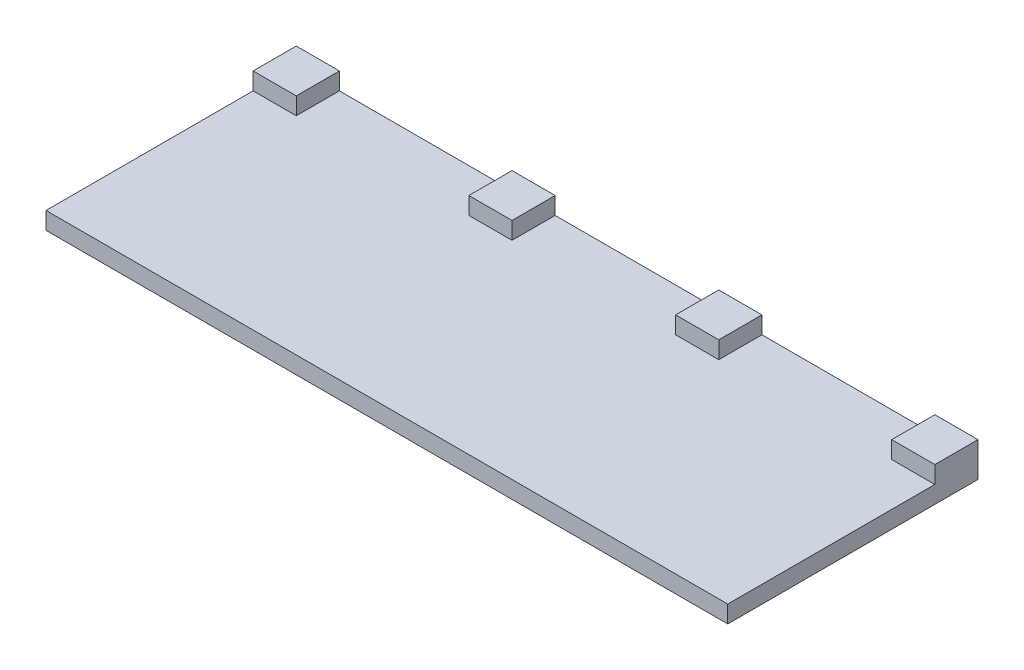
ISO-10303-21;
HEADER;
FILE_DESCRIPTION(('STEP AP214'),'2;1');
FILE_NAME('part.step','',(''),(''),'','','');
FILE_SCHEMA(('AUTOMOTIVE_DESIGN { 1 0 10303 214 1 1 1 1 }'));
ENDSEC;
DATA;
#1=APPLICATION_CONTEXT('core data for automotive mechanical design processes');
#2=APPLICATION_PROTOCOL_DEFINITION('international standard','automotive_design',2000,#1);
#3=PRODUCT_CONTEXT('',#1,'mechanical');
#4=PRODUCT('Part','Part','',(#3));
#5=PRODUCT_RELATED_PRODUCT_CATEGORY('part','',(#4));
#6=PRODUCT_DEFINITION_FORMATION('','',#4);
#7=PRODUCT_DEFINITION_CONTEXT('part definition',#1,'design');
#8=PRODUCT_DEFINITION('design','',#6,#7);
#9=PRODUCT_DEFINITION_SHAPE('','',#8);
#10=(LENGTH_UNIT() NAMED_UNIT(*) SI_UNIT(.MILLI.,.METRE.));
#11=(NAMED_UNIT(*) PLANE_ANGLE_UNIT() SI_UNIT($,.RADIAN.));
#12=(NAMED_UNIT(*) SI_UNIT($,.STERADIAN.) SOLID_ANGLE_UNIT());
#13=UNCERTAINTY_MEASURE_WITH_UNIT(LENGTH_MEASURE(1.E-05),#10,'distance_accuracy_value','');
#14=(GEOMETRIC_REPRESENTATION_CONTEXT(3) GLOBAL_UNCERTAINTY_ASSIGNED_CONTEXT((#13)) GLOBAL_UNIT_ASSIGNED_CONTEXT((#10,
#11,#12)) REPRESENTATION_CONTEXT('',''));
#15=CARTESIAN_POINT('',(0.,0.,0.));
#16=DIRECTION('',(0.,0.,1.));
#17=DIRECTION('',(1.,0.,0.));
#18=AXIS2_PLACEMENT_3D('',#15,#16,#17);
#19=CARTESIAN_POINT('',(0.,2.,0.));
#20=DIRECTION('',(0.,1.,0.));
#21=DIRECTION('',(0.,0.,1.));
#22=AXIS2_PLACEMENT_3D('',#19,#20,#21);
#23=PLANE('',#22);
#24=DIRECTION('',(1.,0.,0.));
#25=VECTOR('',#24,1.);
#26=CARTESIAN_POINT('',(0.,2.,-21.8091096421977));
#27=LINE('',#26,#25);
#28=CARTESIAN_POINT('',(-48.5039157638109,2.,-21.8091096421977));
#29=VERTEX_POINT('',#28);
#30=CARTESIAN_POINT('',(-43.5039157638109,2.,-21.8091096421977));
#31=VERTEX_POINT('',#30);
#32=EDGE_CURVE('E50',#29,#31,#27,.T.);
#33=ORIENTED_EDGE('',*,*,#32,.F.);
#34=DIRECTION('',(0.,0.,-1.));
#35=VECTOR('',#34,1.);
#36=CARTESIAN_POINT('',(-48.5039157638109,2.,0.));
#37=LINE('',#36,#35);
#38=CARTESIAN_POINT('',(-48.5039157638109,2.,-26.8091096421977));
#39=VERTEX_POINT('',#38);
#40=EDGE_CURVE('E190',#29,#39,#37,.T.);
#41=ORIENTED_EDGE('',*,*,#40,.T.);
#42=DIRECTION('',(-1.,0.,0.));
#43=VECTOR('',#42,1.);
#44=CARTESIAN_POINT('',(-18.4636596844427,2.,-26.8091096421977));
#45=LINE('',#44,#43);
#46=CARTESIAN_POINT('',(-67.4636596844427,2.,-26.8091096421977));
#47=VERTEX_POINT('',#46);
#48=EDGE_CURVE('E182',#39,#47,#45,.T.);
#49=ORIENTED_EDGE('',*,*,#48,.T.);
#50=DIRECTION('',(0.,0.,-1.));
#51=VECTOR('',#50,1.);
#52=CARTESIAN_POINT('',(-67.4636596844427,2.,0.));
#53=LINE('',#52,#51);
#54=CARTESIAN_POINT('',(-67.4636596844427,2.,-21.8091096421977));
#55=VERTEX_POINT('',#54);
#56=EDGE_CURVE('E217',#55,#47,#53,.T.);
#57=ORIENTED_EDGE('',*,*,#56,.F.);
#58=DIRECTION('',(-1.,0.,0.));
#59=VECTOR('',#58,1.);
#60=CARTESIAN_POINT('',(0.,2.,-21.8091096421977));
#61=LINE('',#60,#59);
#62=CARTESIAN_POINT('',(-72.4636596844427,2.,-21.8091096421977));
#63=VERTEX_POINT('',#62);
#64=EDGE_CURVE('E211',#55,#63,#61,.T.);
#65=ORIENTED_EDGE('',*,*,#64,.T.);
#66=DIRECTION('',(0.,0.,-1.));
#67=VECTOR('',#66,1.);
#68=CARTESIAN_POINT('',(-72.4636596844427,2.,0.));
#69=LINE('',#68,#67);
#70=CARTESIAN_POINT('',(-72.4636596844427,2.,-26.8091096421977));
#71=VERTEX_POINT('',#70);
#72=EDGE_CURVE('E214',#63,#71,#69,.T.);
#73=ORIENTED_EDGE('',*,*,#72,.T.);
#74=CARTESIAN_POINT('',(-92.4636596844427,2.,-26.8091096421977));
#75=VERTEX_POINT('',#74);
#76=EDGE_CURVE('E273',#71,#75,#45,.T.);
#77=ORIENTED_EDGE('',*,*,#76,.T.);
#78=DIRECTION('',(0.,0.,-1.));
#79=VECTOR('',#78,1.);
#80=CARTESIAN_POINT('',(-92.4636596844427,2.,0.));
#81=LINE('',#80,#79);
#82=CARTESIAN_POINT('',(-92.4636596844427,2.,-21.8091096421977));
#83=VERTEX_POINT('',#82);
#84=EDGE_CURVE('E263',#83,#75,#81,.T.);
#85=ORIENTED_EDGE('',*,*,#84,.F.);
#86=DIRECTION('',(-1.,0.,0.));
#87=VECTOR('',#86,1.);
#88=CARTESIAN_POINT('',(0.,2.,-21.8091096421977));
#89=LINE('',#88,#87);
#90=CARTESIAN_POINT('',(-97.4636596844427,2.,-21.8091096421977));
#91=VERTEX_POINT('',#90);
#92=EDGE_CURVE('E266',#83,#91,#89,.T.);
#93=ORIENTED_EDGE('',*,*,#92,.T.);
#94=DIRECTION('',(0.,0.,1.));
#95=VECTOR('',#94,1.);
#96=CARTESIAN_POINT('',(-97.4636596844427,2.,-26.8091096421977));
#97=LINE('',#96,#95);
#98=CARTESIAN_POINT('',(-97.4636596844427,2.,2.19089035780235));
#99=VERTEX_POINT('',#98);
#100=EDGE_CURVE('E277',#91,#99,#97,.T.);
#101=ORIENTED_EDGE('',*,*,#100,.T.);
#102=DIRECTION('',(1.,0.,0.));
#103=VECTOR('',#102,1.);
#104=CARTESIAN_POINT('',(-97.4636596844427,2.,2.19089035780235));
#105=LINE('',#104,#103);
#106=CARTESIAN_POINT('',(-18.4636596844427,2.,2.19089035780235));
#107=VERTEX_POINT('',#106);
#108=EDGE_CURVE('E279',#99,#107,#105,.T.);
#109=ORIENTED_EDGE('',*,*,#108,.T.);
#110=DIRECTION('',(0.,0.,-1.));
#111=VECTOR('',#110,1.);
#112=CARTESIAN_POINT('',(-18.4636596844427,2.,2.19089035780235));
#113=LINE('',#112,#111);
#114=CARTESIAN_POINT('',(-18.4636596844427,2.,-21.8091096421977));
#115=VERTEX_POINT('',#114);
#116=EDGE_CURVE('E270',#107,#115,#113,.T.);
#117=ORIENTED_EDGE('',*,*,#116,.T.);
#118=DIRECTION('',(-1.,0.,0.));
#119=VECTOR('',#118,1.);
#120=CARTESIAN_POINT('',(0.,2.,-21.8091096421977));
#121=LINE('',#120,#119);
#122=CARTESIAN_POINT('',(-23.4636596844427,2.,-21.8091096421977));
#123=VERTEX_POINT('',#122);
#124=EDGE_CURVE('E241',#115,#123,#121,.T.);
#125=ORIENTED_EDGE('',*,*,#124,.T.);
#126=DIRECTION('',(0.,0.,-1.));
#127=VECTOR('',#126,1.);
#128=CARTESIAN_POINT('',(-23.4636596844427,2.,0.));
#129=LINE('',#128,#127);
#130=CARTESIAN_POINT('',(-23.4636596844427,2.,-26.8091096421977));
#131=VERTEX_POINT('',#130);
#132=EDGE_CURVE('E238',#123,#131,#129,.T.);
#133=ORIENTED_EDGE('',*,*,#132,.T.);
#134=CARTESIAN_POINT('',(-43.5039157638109,2.,-26.8091096421977));
#135=VERTEX_POINT('',#134);
#136=EDGE_CURVE('E275',#131,#135,#45,.T.);
#137=ORIENTED_EDGE('',*,*,#136,.T.);
#138=DIRECTION('',(0.,0.,-1.));
#139=VECTOR('',#138,1.);
#140=CARTESIAN_POINT('',(-43.5039157638109,2.,0.));
#141=LINE('',#140,#139);
#142=EDGE_CURVE('E55',#31,#135,#141,.T.);
#143=ORIENTED_EDGE('',*,*,#142,.F.);
#144=EDGE_LOOP('',(#33,#41,#49,#57,#65,#73,#77,#85,#93,#101,#109,#117,#125,#133,#137,#143));
#145=FACE_BOUND('',#144,.T.);
#146=ADVANCED_FACE('F35',(#145),#23,.T.);
#147=CARTESIAN_POINT('',(-18.4636596844427,2.,2.19089035780235));
#148=DIRECTION('',(-1.,0.,0.));
#149=DIRECTION('',(0.,0.,1.));
#150=AXIS2_PLACEMENT_3D('',#147,#148,#149);
#151=PLANE('',#150);
#152=DIRECTION('',(0.,-1.,0.));
#153=VECTOR('',#152,1.);
#154=CARTESIAN_POINT('',(-18.4636596844427,2.,-26.8091096421977));
#155=LINE('',#154,#153);
#156=CARTESIAN_POINT('',(-18.4636596844427,4.,-26.8091096421977));
#157=VERTEX_POINT('',#156);
#158=CARTESIAN_POINT('',(-18.4636596844427,0.,-26.8091096421977));
#159=VERTEX_POINT('',#158);
#160=EDGE_CURVE('E11',#157,#159,#155,.T.);
#161=ORIENTED_EDGE('',*,*,#160,.F.);
#162=DIRECTION('',(0.,0.,1.));
#163=VECTOR('',#162,1.);
#164=CARTESIAN_POINT('',(-18.4636596844427,4.,-26.8091096421977));
#165=LINE('',#164,#163);
#166=CARTESIAN_POINT('',(-18.4636596844427,4.,-21.8091096421977));
#167=VERTEX_POINT('',#166);
#168=EDGE_CURVE('E233',#157,#167,#165,.T.);
#169=ORIENTED_EDGE('',*,*,#168,.T.);
#170=DIRECTION('',(0.,-1.,0.));
#171=VECTOR('',#170,1.);
#172=CARTESIAN_POINT('',(-18.4636596844427,4.,-21.8091096421977));
#173=LINE('',#172,#171);
#174=EDGE_CURVE('E220',#167,#115,#173,.T.);
#175=ORIENTED_EDGE('',*,*,#174,.T.);
#176=ORIENTED_EDGE('',*,*,#116,.F.);
#177=DIRECTION('',(0.,-1.,0.));
#178=VECTOR('',#177,1.);
#179=CARTESIAN_POINT('',(-18.4636596844427,2.,2.19089035780235));
#180=LINE('',#179,#178);
#181=CARTESIAN_POINT('',(-18.4636596844427,0.,2.19089035780235));
#182=VERTEX_POINT('',#181);
#183=EDGE_CURVE('E281',#107,#182,#180,.T.);
#184=ORIENTED_EDGE('',*,*,#183,.T.);
#185=DIRECTION('',(0.,0.,-1.));
#186=VECTOR('',#185,1.);
#187=CARTESIAN_POINT('',(-18.4636596844427,0.,2.19089035780235));
#188=LINE('',#187,#186);
#189=EDGE_CURVE('E269',#182,#159,#188,.T.);
#190=ORIENTED_EDGE('',*,*,#189,.T.);
#191=EDGE_LOOP('',(#161,#169,#175,#176,#184,#190));
#192=FACE_BOUND('',#191,.T.);
#193=ADVANCED_FACE('F37',(#192),#151,.F.);
#194=CARTESIAN_POINT('',(-18.4636596844427,2.,-26.8091096421977));
#195=DIRECTION('',(0.,0.,1.));
#196=DIRECTION('',(1.,0.,0.));
#197=AXIS2_PLACEMENT_3D('',#194,#195,#196);
#198=PLANE('',#197);
#199=DIRECTION('',(-1.,0.,0.));
#200=VECTOR('',#199,1.);
#201=CARTESIAN_POINT('',(-18.4636596844427,0.,-26.8091096421977));
#202=LINE('',#201,#200);
#203=CARTESIAN_POINT('',(-97.4636596844427,0.,-26.8091096421977));
#204=VERTEX_POINT('',#203);
#205=EDGE_CURVE('E283',#159,#204,#202,.T.);
#206=ORIENTED_EDGE('',*,*,#205,.T.);
#207=DIRECTION('',(0.,-1.,0.));
#208=VECTOR('',#207,1.);
#209=CARTESIAN_POINT('',(-97.4636596844427,2.,-26.8091096421977));
#210=LINE('',#209,#208);
#211=CARTESIAN_POINT('',(-97.4636596844427,4.,-26.8091096421977));
#212=VERTEX_POINT('',#211);
#213=EDGE_CURVE('E43',#212,#204,#210,.T.);
#214=ORIENTED_EDGE('',*,*,#213,.F.);
#215=DIRECTION('',(1.,0.,0.));
#216=VECTOR('',#215,1.);
#217=CARTESIAN_POINT('',(-97.4636596844427,4.,-26.8091096421977));
#218=LINE('',#217,#216);
#219=CARTESIAN_POINT('',(-92.4636596844427,4.,-26.8091096421977));
#220=VERTEX_POINT('',#219);
#221=EDGE_CURVE('E249',#212,#220,#218,.T.);
#222=ORIENTED_EDGE('',*,*,#221,.T.);
#223=DIRECTION('',(0.,-1.,0.));
#224=VECTOR('',#223,1.);
#225=CARTESIAN_POINT('',(-92.4636596844427,4.,-26.8091096421977));
#226=LINE('',#225,#224);
#227=EDGE_CURVE('E257',#220,#75,#226,.T.);
#228=ORIENTED_EDGE('',*,*,#227,.T.);
#229=ORIENTED_EDGE('',*,*,#76,.F.);
#230=DIRECTION('',(0.,-1.,0.));
#231=VECTOR('',#230,1.);
#232=CARTESIAN_POINT('',(-72.4636596844427,4.,-26.8091096421977));
#233=LINE('',#232,#231);
#234=CARTESIAN_POINT('',(-72.4636596844427,4.,-26.8091096421977));
#235=VERTEX_POINT('',#234);
#236=EDGE_CURVE('E207',#235,#71,#233,.T.);
#237=ORIENTED_EDGE('',*,*,#236,.F.);
#238=DIRECTION('',(1.,0.,0.));
#239=VECTOR('',#238,1.);
#240=CARTESIAN_POINT('',(0.,4.,-26.8091096421977));
#241=LINE('',#240,#239);
#242=CARTESIAN_POINT('',(-67.4636596844427,4.,-26.8091096421977));
#243=VERTEX_POINT('',#242);
#244=EDGE_CURVE('E195',#235,#243,#241,.T.);
#245=ORIENTED_EDGE('',*,*,#244,.T.);
#246=DIRECTION('',(0.,-1.,0.));
#247=VECTOR('',#246,1.);
#248=CARTESIAN_POINT('',(-67.4636596844427,4.,-26.8091096421977));
#249=LINE('',#248,#247);
#250=EDGE_CURVE('E209',#243,#47,#249,.T.);
#251=ORIENTED_EDGE('',*,*,#250,.T.);
#252=ORIENTED_EDGE('',*,*,#48,.F.);
#253=DIRECTION('',(0.,-1.,0.));
#254=VECTOR('',#253,1.);
#255=CARTESIAN_POINT('',(-48.5039157638109,4.,-26.8091096421977));
#256=LINE('',#255,#254);
#257=CARTESIAN_POINT('',(-48.5039157638109,4.,-26.8091096421977));
#258=VERTEX_POINT('',#257);
#259=EDGE_CURVE('E162',#258,#39,#256,.T.);
#260=ORIENTED_EDGE('',*,*,#259,.F.);
#261=DIRECTION('',(-1.,0.,0.));
#262=VECTOR('',#261,1.);
#263=CARTESIAN_POINT('',(0.,4.,-26.8091096421977));
#264=LINE('',#263,#262);
#265=CARTESIAN_POINT('',(-43.5039157638109,4.,-26.8091096421977));
#266=VERTEX_POINT('',#265);
#267=EDGE_CURVE('E169',#266,#258,#264,.T.);
#268=ORIENTED_EDGE('',*,*,#267,.F.);
#269=DIRECTION('',(0.,-1.,0.));
#270=VECTOR('',#269,1.);
#271=CARTESIAN_POINT('',(-43.5039157638109,4.,-26.8091096421977));
#272=LINE('',#271,#270);
#273=EDGE_CURVE('E480',#266,#135,#272,.T.);
#274=ORIENTED_EDGE('',*,*,#273,.T.);
#275=ORIENTED_EDGE('',*,*,#136,.F.);
#276=DIRECTION('',(0.,-1.,0.));
#277=VECTOR('',#276,1.);
#278=CARTESIAN_POINT('',(-23.4636596844427,4.,-26.8091096421977));
#279=LINE('',#278,#277);
#280=CARTESIAN_POINT('',(-23.4636596844427,4.,-26.8091096421977));
#281=VERTEX_POINT('',#280);
#282=EDGE_CURVE('E223',#281,#131,#279,.T.);
#283=ORIENTED_EDGE('',*,*,#282,.F.);
#284=DIRECTION('',(1.,0.,0.));
#285=VECTOR('',#284,1.);
#286=CARTESIAN_POINT('',(-23.4636596844427,4.,-26.8091096421977));
#287=LINE('',#286,#285);
#288=EDGE_CURVE('E230',#281,#157,#287,.T.);
#289=ORIENTED_EDGE('',*,*,#288,.T.);
#290=ORIENTED_EDGE('',*,*,#160,.T.);
#291=EDGE_LOOP('',(#206,#214,#222,#228,#229,#237,#245,#251,#252,#260,#268,#274,#275,#283,#289,#290));
#292=FACE_BOUND('',#291,.T.);
#293=ADVANCED_FACE('F180',(#292),#198,.F.);
#294=CARTESIAN_POINT('',(-97.4636596844427,2.,-26.8091096421977));
#295=DIRECTION('',(1.,0.,0.));
#296=DIRECTION('',(0.,0.,-1.));
#297=AXIS2_PLACEMENT_3D('',#294,#295,#296);
#298=PLANE('',#297);
#299=DIRECTION('',(0.,0.,1.));
#300=VECTOR('',#299,1.);
#301=CARTESIAN_POINT('',(-97.4636596844427,0.,-26.8091096421977));
#302=LINE('',#301,#300);
#303=CARTESIAN_POINT('',(-97.4636596844427,0.,2.19089035780235));
#304=VERTEX_POINT('',#303);
#305=EDGE_CURVE('E285',#204,#304,#302,.T.);
#306=ORIENTED_EDGE('',*,*,#305,.T.);
#307=DIRECTION('',(0.,-1.,0.));
#308=VECTOR('',#307,1.);
#309=CARTESIAN_POINT('',(-97.4636596844427,2.,2.19089035780235));
#310=LINE('',#309,#308);
#311=EDGE_CURVE('E290',#99,#304,#310,.T.);
#312=ORIENTED_EDGE('',*,*,#311,.F.);
#313=ORIENTED_EDGE('',*,*,#100,.F.);
#314=DIRECTION('',(0.,-1.,0.));
#315=VECTOR('',#314,1.);
#316=CARTESIAN_POINT('',(-97.4636596844427,4.,-21.8091096421977));
#317=LINE('',#316,#315);
#318=CARTESIAN_POINT('',(-97.4636596844427,4.,-21.8091096421977));
#319=VERTEX_POINT('',#318);
#320=EDGE_CURVE('E254',#319,#91,#317,.T.);
#321=ORIENTED_EDGE('',*,*,#320,.F.);
#322=DIRECTION('',(0.,0.,1.));
#323=VECTOR('',#322,1.);
#324=CARTESIAN_POINT('',(-97.4636596844427,4.,-26.8091096421977));
#325=LINE('',#324,#323);
#326=EDGE_CURVE('E252',#212,#319,#325,.T.);
#327=ORIENTED_EDGE('',*,*,#326,.F.);
#328=ORIENTED_EDGE('',*,*,#213,.T.);
#329=EDGE_LOOP('',(#306,#312,#313,#321,#327,#328));
#330=FACE_BOUND('',#329,.T.);
#331=ADVANCED_FACE('F296',(#330),#298,.F.);
#332=CARTESIAN_POINT('',(-97.4636596844427,2.,2.19089035780235));
#333=DIRECTION('',(0.,0.,-1.));
#334=DIRECTION('',(-1.,0.,0.));
#335=AXIS2_PLACEMENT_3D('',#332,#333,#334);
#336=PLANE('',#335);
#337=DIRECTION('',(1.,0.,0.));
#338=VECTOR('',#337,1.);
#339=CARTESIAN_POINT('',(-97.4636596844427,0.,2.19089035780235));
#340=LINE('',#339,#338);
#341=EDGE_CURVE('E274',#304,#182,#340,.T.);
#342=ORIENTED_EDGE('',*,*,#341,.T.);
#343=ORIENTED_EDGE('',*,*,#183,.F.);
#344=ORIENTED_EDGE('',*,*,#108,.F.);
#345=ORIENTED_EDGE('',*,*,#311,.T.);
#346=EDGE_LOOP('',(#342,#343,#344,#345));
#347=FACE_BOUND('',#346,.T.);
#348=ADVANCED_FACE('F307',(#347),#336,.F.);
#349=CARTESIAN_POINT('',(0.,0.,0.));
#350=DIRECTION('',(0.,1.,0.));
#351=DIRECTION('',(0.,0.,1.));
#352=AXIS2_PLACEMENT_3D('',#349,#350,#351);
#353=PLANE('',#352);
#354=ORIENTED_EDGE('',*,*,#305,.F.);
#355=ORIENTED_EDGE('',*,*,#205,.F.);
#356=ORIENTED_EDGE('',*,*,#189,.F.);
#357=ORIENTED_EDGE('',*,*,#341,.F.);
#358=EDGE_LOOP('',(#354,#355,#356,#357));
#359=FACE_BOUND('',#358,.T.);
#360=ADVANCED_FACE('F303',(#359),#353,.F.);
#361=CARTESIAN_POINT('',(-97.4636596844427,4.,-21.8091096421977));
#362=DIRECTION('',(0.,0.,-1.));
#363=DIRECTION('',(-1.,0.,0.));
#364=AXIS2_PLACEMENT_3D('',#361,#362,#363);
#365=PLANE('',#364);
#366=ORIENTED_EDGE('',*,*,#92,.F.);
#367=DIRECTION('',(0.,-1.,0.));
#368=VECTOR('',#367,1.);
#369=CARTESIAN_POINT('',(-92.4636596844427,4.,-21.8091096421977));
#370=LINE('',#369,#368);
#371=CARTESIAN_POINT('',(-92.4636596844427,4.,-21.8091096421977));
#372=VERTEX_POINT('',#371);
#373=EDGE_CURVE('E260',#372,#83,#370,.T.);
#374=ORIENTED_EDGE('',*,*,#373,.F.);
#375=DIRECTION('',(1.,0.,0.));
#376=VECTOR('',#375,1.);
#377=CARTESIAN_POINT('',(-97.4636596844427,4.,-21.8091096421977));
#378=LINE('',#377,#376);
#379=EDGE_CURVE('E244',#319,#372,#378,.T.);
#380=ORIENTED_EDGE('',*,*,#379,.F.);
#381=ORIENTED_EDGE('',*,*,#320,.T.);
#382=EDGE_LOOP('',(#366,#374,#380,#381));
#383=FACE_BOUND('',#382,.T.);
#384=ADVANCED_FACE('F316',(#383),#365,.F.);
#385=CARTESIAN_POINT('',(-92.4636596844427,4.,-26.8091096421977));
#386=DIRECTION('',(1.,0.,0.));
#387=DIRECTION('',(0.,0.,-1.));
#388=AXIS2_PLACEMENT_3D('',#385,#386,#387);
#389=PLANE('',#388);
#390=ORIENTED_EDGE('',*,*,#373,.T.);
#391=ORIENTED_EDGE('',*,*,#84,.T.);
#392=ORIENTED_EDGE('',*,*,#227,.F.);
#393=DIRECTION('',(0.,0.,1.));
#394=VECTOR('',#393,1.);
#395=CARTESIAN_POINT('',(-92.4636596844427,4.,-26.8091096421977));
#396=LINE('',#395,#394);
#397=EDGE_CURVE('E246',#220,#372,#396,.T.);
#398=ORIENTED_EDGE('',*,*,#397,.T.);
#399=EDGE_LOOP('',(#390,#391,#392,#398));
#400=FACE_BOUND('',#399,.T.);
#401=ADVANCED_FACE('F322',(#400),#389,.T.);
#402=CARTESIAN_POINT('',(0.,4.,0.));
#403=DIRECTION('',(0.,-1.,0.));
#404=DIRECTION('',(0.,0.,-1.));
#405=AXIS2_PLACEMENT_3D('',#402,#403,#404);
#406=PLANE('',#405);
#407=ORIENTED_EDGE('',*,*,#379,.T.);
#408=ORIENTED_EDGE('',*,*,#397,.F.);
#409=ORIENTED_EDGE('',*,*,#221,.F.);
#410=ORIENTED_EDGE('',*,*,#326,.T.);
#411=EDGE_LOOP('',(#407,#408,#409,#410));
#412=FACE_BOUND('',#411,.T.);
#413=ADVANCED_FACE('F319',(#412),#406,.F.);
#414=CARTESIAN_POINT('',(-23.4636596844427,4.,-21.8091096421977));
#415=DIRECTION('',(0.,0.,-1.));
#416=DIRECTION('',(-1.,0.,0.));
#417=AXIS2_PLACEMENT_3D('',#414,#415,#416);
#418=PLANE('',#417);
#419=ORIENTED_EDGE('',*,*,#124,.F.);
#420=ORIENTED_EDGE('',*,*,#174,.F.);
#421=DIRECTION('',(1.,0.,0.));
#422=VECTOR('',#421,1.);
#423=CARTESIAN_POINT('',(-23.4636596844427,4.,-21.8091096421977));
#424=LINE('',#423,#422);
#425=CARTESIAN_POINT('',(-23.4636596844427,4.,-21.8091096421977));
#426=VERTEX_POINT('',#425);
#427=EDGE_CURVE('E236',#426,#167,#424,.T.);
#428=ORIENTED_EDGE('',*,*,#427,.F.);
#429=DIRECTION('',(0.,-1.,0.));
#430=VECTOR('',#429,1.);
#431=CARTESIAN_POINT('',(-23.4636596844427,4.,-21.8091096421977));
#432=LINE('',#431,#430);
#433=EDGE_CURVE('E225',#426,#123,#432,.T.);
#434=ORIENTED_EDGE('',*,*,#433,.T.);
#435=EDGE_LOOP('',(#419,#420,#428,#434));
#436=FACE_BOUND('',#435,.T.);
#437=ADVANCED_FACE('F395',(#436),#418,.F.);
#438=CARTESIAN_POINT('',(-23.4636596844427,4.,-26.8091096421977));
#439=DIRECTION('',(1.,0.,0.));
#440=DIRECTION('',(0.,0.,-1.));
#441=AXIS2_PLACEMENT_3D('',#438,#439,#440);
#442=PLANE('',#441);
#443=ORIENTED_EDGE('',*,*,#132,.F.);
#444=ORIENTED_EDGE('',*,*,#433,.F.);
#445=DIRECTION('',(0.,0.,1.));
#446=VECTOR('',#445,1.);
#447=CARTESIAN_POINT('',(-23.4636596844427,4.,-26.8091096421977));
#448=LINE('',#447,#446);
#449=EDGE_CURVE('E228',#281,#426,#448,.T.);
#450=ORIENTED_EDGE('',*,*,#449,.F.);
#451=ORIENTED_EDGE('',*,*,#282,.T.);
#452=EDGE_LOOP('',(#443,#444,#450,#451));
#453=FACE_BOUND('',#452,.T.);
#454=ADVANCED_FACE('F402',(#453),#442,.F.);
#455=CARTESIAN_POINT('',(0.,4.,0.));
#456=DIRECTION('',(0.,-1.,0.));
#457=DIRECTION('',(0.,0.,-1.));
#458=AXIS2_PLACEMENT_3D('',#455,#456,#457);
#459=PLANE('',#458);
#460=ORIENTED_EDGE('',*,*,#427,.T.);
#461=ORIENTED_EDGE('',*,*,#168,.F.);
#462=ORIENTED_EDGE('',*,*,#288,.F.);
#463=ORIENTED_EDGE('',*,*,#449,.T.);
#464=EDGE_LOOP('',(#460,#461,#462,#463));
#465=FACE_BOUND('',#464,.T.);
#466=ADVANCED_FACE('F346',(#465),#459,.F.);
#467=CARTESIAN_POINT('',(-67.4636596844427,4.,0.));
#468=DIRECTION('',(1.,0.,0.));
#469=DIRECTION('',(0.,0.,-1.));
#470=AXIS2_PLACEMENT_3D('',#467,#468,#469);
#471=PLANE('',#470);
#472=DIRECTION('',(0.,-1.,0.));
#473=VECTOR('',#472,1.);
#474=CARTESIAN_POINT('',(-67.4636596844427,4.,-21.8091096421977));
#475=LINE('',#474,#473);
#476=CARTESIAN_POINT('',(-67.4636596844427,4.,-21.8091096421977));
#477=VERTEX_POINT('',#476);
#478=EDGE_CURVE('E202',#477,#55,#475,.T.);
#479=ORIENTED_EDGE('',*,*,#478,.T.);
#480=ORIENTED_EDGE('',*,*,#56,.T.);
#481=ORIENTED_EDGE('',*,*,#250,.F.);
#482=DIRECTION('',(0.,0.,1.));
#483=VECTOR('',#482,1.);
#484=CARTESIAN_POINT('',(-67.4636596844427,4.,0.));
#485=LINE('',#484,#483);
#486=EDGE_CURVE('E192',#243,#477,#485,.T.);
#487=ORIENTED_EDGE('',*,*,#486,.T.);
#488=EDGE_LOOP('',(#479,#480,#481,#487));
#489=FACE_BOUND('',#488,.T.);
#490=ADVANCED_FACE('F326',(#489),#471,.T.);
#491=CARTESIAN_POINT('',(-72.4636596844427,4.,0.));
#492=DIRECTION('',(1.,0.,0.));
#493=DIRECTION('',(0.,0.,-1.));
#494=AXIS2_PLACEMENT_3D('',#491,#492,#493);
#495=PLANE('',#494);
#496=ORIENTED_EDGE('',*,*,#72,.F.);
#497=DIRECTION('',(0.,-1.,0.));
#498=VECTOR('',#497,1.);
#499=CARTESIAN_POINT('',(-72.4636596844427,4.,-21.8091096421977));
#500=LINE('',#499,#498);
#501=CARTESIAN_POINT('',(-72.4636596844427,4.,-21.8091096421977));
#502=VERTEX_POINT('',#501);
#503=EDGE_CURVE('E205',#502,#63,#500,.T.);
#504=ORIENTED_EDGE('',*,*,#503,.F.);
#505=DIRECTION('',(0.,0.,1.));
#506=VECTOR('',#505,1.);
#507=CARTESIAN_POINT('',(-72.4636596844427,4.,0.));
#508=LINE('',#507,#506);
#509=EDGE_CURVE('E198',#235,#502,#508,.T.);
#510=ORIENTED_EDGE('',*,*,#509,.F.);
#511=ORIENTED_EDGE('',*,*,#236,.T.);
#512=EDGE_LOOP('',(#496,#504,#510,#511));
#513=FACE_BOUND('',#512,.T.);
#514=ADVANCED_FACE('F338',(#513),#495,.F.);
#515=CARTESIAN_POINT('',(0.,4.,-21.8091096421977));
#516=DIRECTION('',(0.,0.,-1.));
#517=DIRECTION('',(-1.,0.,0.));
#518=AXIS2_PLACEMENT_3D('',#515,#516,#517);
#519=PLANE('',#518);
#520=ORIENTED_EDGE('',*,*,#64,.F.);
#521=ORIENTED_EDGE('',*,*,#478,.F.);
#522=DIRECTION('',(1.,0.,0.));
#523=VECTOR('',#522,1.);
#524=CARTESIAN_POINT('',(0.,4.,-21.8091096421977));
#525=LINE('',#524,#523);
#526=EDGE_CURVE('E200',#502,#477,#525,.T.);
#527=ORIENTED_EDGE('',*,*,#526,.F.);
#528=ORIENTED_EDGE('',*,*,#503,.T.);
#529=EDGE_LOOP('',(#520,#521,#527,#528));
#530=FACE_BOUND('',#529,.T.);
#531=ADVANCED_FACE('F336',(#530),#519,.F.);
#532=CARTESIAN_POINT('',(0.,4.,0.));
#533=DIRECTION('',(0.,1.,0.));
#534=DIRECTION('',(0.,0.,1.));
#535=AXIS2_PLACEMENT_3D('',#532,#533,#534);
#536=PLANE('',#535);
#537=ORIENTED_EDGE('',*,*,#486,.F.);
#538=ORIENTED_EDGE('',*,*,#244,.F.);
#539=ORIENTED_EDGE('',*,*,#509,.T.);
#540=ORIENTED_EDGE('',*,*,#526,.T.);
#541=EDGE_LOOP('',(#537,#538,#539,#540));
#542=FACE_BOUND('',#541,.T.);
#543=ADVANCED_FACE('F332',(#542),#536,.T.);
#544=CARTESIAN_POINT('',(-48.5039157638109,4.,0.));
#545=DIRECTION('',(1.,0.,0.));
#546=DIRECTION('',(0.,0.,-1.));
#547=AXIS2_PLACEMENT_3D('',#544,#545,#546);
#548=PLANE('',#547);
#549=ORIENTED_EDGE('',*,*,#40,.F.);
#550=DIRECTION('',(0.,-1.,0.));
#551=VECTOR('',#550,1.);
#552=CARTESIAN_POINT('',(-48.5039157638109,4.,-21.8091096421977));
#553=LINE('',#552,#551);
#554=CARTESIAN_POINT('',(-48.5039157638109,4.,-21.8091096421977));
#555=VERTEX_POINT('',#554);
#556=EDGE_CURVE('E164',#555,#29,#553,.T.);
#557=ORIENTED_EDGE('',*,*,#556,.F.);
#558=DIRECTION('',(0.,0.,1.));
#559=VECTOR('',#558,1.);
#560=CARTESIAN_POINT('',(-48.5039157638109,4.,0.));
#561=LINE('',#560,#559);
#562=EDGE_CURVE('E158',#258,#555,#561,.T.);
#563=ORIENTED_EDGE('',*,*,#562,.F.);
#564=ORIENTED_EDGE('',*,*,#259,.T.);
#565=EDGE_LOOP('',(#549,#557,#563,#564));
#566=FACE_BOUND('',#565,.T.);
#567=ADVANCED_FACE('F160',(#566),#548,.F.);
#568=CARTESIAN_POINT('',(0.,4.,-21.8091096421977));
#569=DIRECTION('',(0.,0.,1.));
#570=DIRECTION('',(1.,0.,0.));
#571=AXIS2_PLACEMENT_3D('',#568,#569,#570);
#572=PLANE('',#571);
#573=ORIENTED_EDGE('',*,*,#556,.T.);
#574=ORIENTED_EDGE('',*,*,#32,.T.);
#575=DIRECTION('',(0.,-1.,0.));
#576=VECTOR('',#575,1.);
#577=CARTESIAN_POINT('',(-43.5039157638109,4.,-21.8091096421977));
#578=LINE('',#577,#576);
#579=CARTESIAN_POINT('',(-43.5039157638109,4.,-21.8091096421977));
#580=VERTEX_POINT('',#579);
#581=EDGE_CURVE('E185',#580,#31,#578,.T.);
#582=ORIENTED_EDGE('',*,*,#581,.F.);
#583=DIRECTION('',(-1.,0.,0.));
#584=VECTOR('',#583,1.);
#585=CARTESIAN_POINT('',(0.,4.,-21.8091096421977));
#586=LINE('',#585,#584);
#587=EDGE_CURVE('E168',#580,#555,#586,.T.);
#588=ORIENTED_EDGE('',*,*,#587,.T.);
#589=EDGE_LOOP('',(#573,#574,#582,#588));
#590=FACE_BOUND('',#589,.T.);
#591=ADVANCED_FACE('F448',(#590),#572,.T.);
#592=CARTESIAN_POINT('',(-43.5039157638109,4.,0.));
#593=DIRECTION('',(1.,0.,0.));
#594=DIRECTION('',(0.,0.,-1.));
#595=AXIS2_PLACEMENT_3D('',#592,#593,#594);
#596=PLANE('',#595);
#597=ORIENTED_EDGE('',*,*,#581,.T.);
#598=ORIENTED_EDGE('',*,*,#142,.T.);
#599=ORIENTED_EDGE('',*,*,#273,.F.);
#600=DIRECTION('',(0.,0.,1.));
#601=VECTOR('',#600,1.);
#602=CARTESIAN_POINT('',(-43.5039157638109,4.,0.));
#603=LINE('',#602,#601);
#604=EDGE_CURVE('E175',#266,#580,#603,.T.);
#605=ORIENTED_EDGE('',*,*,#604,.T.);
#606=EDGE_LOOP('',(#597,#598,#599,#605));
#607=FACE_BOUND('',#606,.T.);
#608=ADVANCED_FACE('F457',(#607),#596,.T.);
#609=CARTESIAN_POINT('',(0.,4.,0.));
#610=DIRECTION('',(0.,1.,0.));
#611=DIRECTION('',(0.,0.,1.));
#612=AXIS2_PLACEMENT_3D('',#609,#610,#611);
#613=PLANE('',#612);
#614=ORIENTED_EDGE('',*,*,#267,.T.);
#615=ORIENTED_EDGE('',*,*,#562,.T.);
#616=ORIENTED_EDGE('',*,*,#587,.F.);
#617=ORIENTED_EDGE('',*,*,#604,.F.);
#618=EDGE_LOOP('',(#614,#615,#616,#617));
#619=FACE_BOUND('',#618,.T.);
#620=ADVANCED_FACE('F173',(#619),#613,.T.);
#621=CLOSED_SHELL('',(#146,#193,#293,#331,#348,#360,#384,#401,#413,#437,#454,#466,#490,#514,
#531,#543,#567,#591,#608,#620));
#622=MANIFOLD_SOLID_BREP('B2',#621);
#623=ADVANCED_BREP_SHAPE_REPRESENTATION('',(#18,#622),#14);
#624=SHAPE_DEFINITION_REPRESENTATION(#9,#623);
ENDSEC;
END-ISO-10303-21;
